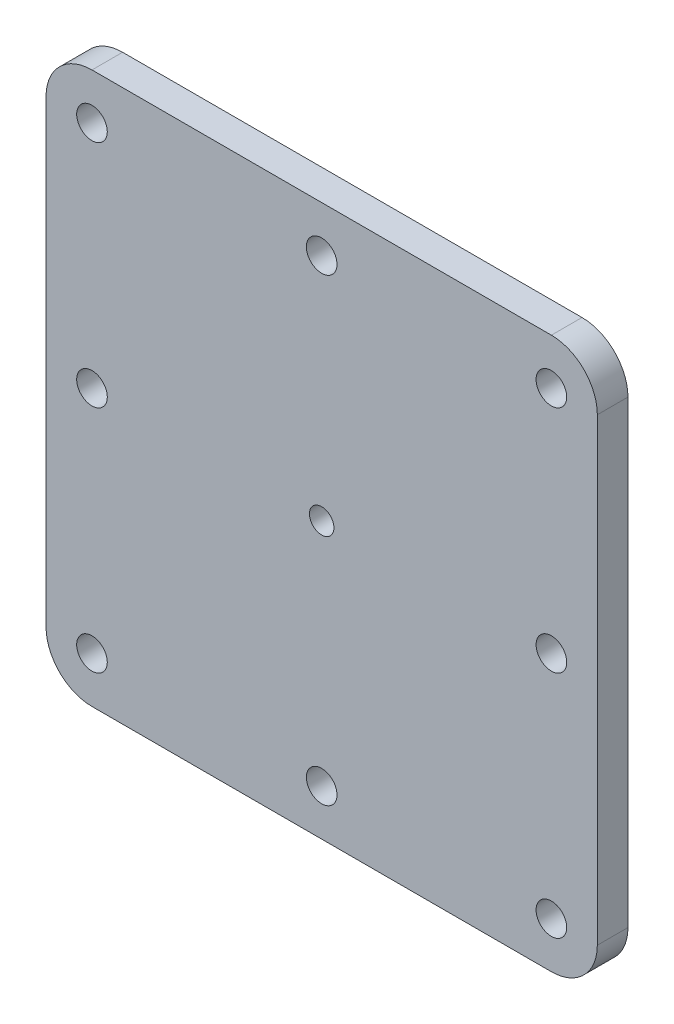
ISO-10303-21;
HEADER;
FILE_DESCRIPTION(('STEP AP214'),'2;1');
FILE_NAME('part.step','',(''),(''),'','','');
FILE_SCHEMA(('AUTOMOTIVE_DESIGN { 1 0 10303 214 1 1 1 1 }'));
ENDSEC;
DATA;
#1=APPLICATION_CONTEXT('core data for automotive mechanical design processes');
#2=APPLICATION_PROTOCOL_DEFINITION('international standard','automotive_design',2000,#1);
#3=PRODUCT_CONTEXT('',#1,'mechanical');
#4=PRODUCT('Part','Part','',(#3));
#5=PRODUCT_RELATED_PRODUCT_CATEGORY('part','',(#4));
#6=PRODUCT_DEFINITION_FORMATION('','',#4);
#7=PRODUCT_DEFINITION_CONTEXT('part definition',#1,'design');
#8=PRODUCT_DEFINITION('design','',#6,#7);
#9=PRODUCT_DEFINITION_SHAPE('','',#8);
#10=(LENGTH_UNIT() NAMED_UNIT(*) SI_UNIT(.MILLI.,.METRE.));
#11=(NAMED_UNIT(*) PLANE_ANGLE_UNIT() SI_UNIT($,.RADIAN.));
#12=(NAMED_UNIT(*) SI_UNIT($,.STERADIAN.) SOLID_ANGLE_UNIT());
#13=UNCERTAINTY_MEASURE_WITH_UNIT(LENGTH_MEASURE(1.E-05),#10,'distance_accuracy_value','');
#14=(GEOMETRIC_REPRESENTATION_CONTEXT(3) GLOBAL_UNCERTAINTY_ASSIGNED_CONTEXT((#13)) GLOBAL_UNIT_ASSIGNED_CONTEXT((#10,
#11,#12)) REPRESENTATION_CONTEXT('',''));
#15=CARTESIAN_POINT('',(0.,0.,0.));
#16=DIRECTION('',(0.,0.,1.));
#17=DIRECTION('',(1.,0.,0.));
#18=AXIS2_PLACEMENT_3D('',#15,#16,#17);
#19=CARTESIAN_POINT('',(-75.,-75.,10.));
#20=DIRECTION('',(0.,0.,1.));
#21=DIRECTION('',(1.,0.,0.));
#22=AXIS2_PLACEMENT_3D('',#19,#20,#21);
#23=PLANE('',#22);
#24=CARTESIAN_POINT('',(0.,0.,10.));
#25=DIRECTION('',(0.,0.,1.));
#26=DIRECTION('',(1.,0.,0.));
#27=AXIS2_PLACEMENT_3D('',#24,#25,#26);
#28=CIRCLE('',#27,4.);
#29=CARTESIAN_POINT('',(3.99999999999999,0.,10.));
#30=VERTEX_POINT('',#29);
#31=EDGE_CURVE('E227',#30,#30,#28,.T.);
#32=ORIENTED_EDGE('',*,*,#31,.F.);
#33=EDGE_LOOP('',(#32));
#34=FACE_BOUND('',#33,.T.);
#35=CARTESIAN_POINT('',(1.54341102686378E-12,-75.,10.));
#36=DIRECTION('',(0.,0.,1.));
#37=DIRECTION('',(1.,0.,0.));
#38=AXIS2_PLACEMENT_3D('',#35,#36,#37);
#39=CIRCLE('',#38,5.);
#40=CARTESIAN_POINT('',(5.00000000000154,-75.,10.));
#41=VERTEX_POINT('',#40);
#42=EDGE_CURVE('E212',#41,#41,#39,.T.);
#43=ORIENTED_EDGE('',*,*,#42,.F.);
#44=EDGE_LOOP('',(#43));
#45=FACE_BOUND('',#44,.T.);
#46=CARTESIAN_POINT('',(75.0000000000008,0.,10.));
#47=DIRECTION('',(0.,0.,1.));
#48=DIRECTION('',(1.,0.,0.));
#49=AXIS2_PLACEMENT_3D('',#46,#47,#48);
#50=CIRCLE('',#49,5.);
#51=CARTESIAN_POINT('',(80.0000000000008,0.,10.));
#52=VERTEX_POINT('',#51);
#53=EDGE_CURVE('E200',#52,#52,#50,.T.);
#54=ORIENTED_EDGE('',*,*,#53,.F.);
#55=EDGE_LOOP('',(#54));
#56=FACE_BOUND('',#55,.T.);
#57=CARTESIAN_POINT('',(75.,75.,10.));
#58=DIRECTION('',(0.,0.,1.));
#59=DIRECTION('',(1.,0.,0.));
#60=AXIS2_PLACEMENT_3D('',#57,#58,#59);
#61=CIRCLE('',#60,5.00000000000001);
#62=CARTESIAN_POINT('',(80.,75.,10.));
#63=VERTEX_POINT('',#62);
#64=EDGE_CURVE('E188',#63,#63,#61,.T.);
#65=ORIENTED_EDGE('',*,*,#64,.F.);
#66=EDGE_LOOP('',(#65));
#67=FACE_BOUND('',#66,.T.);
#68=CARTESIAN_POINT('',(-75.,75.,10.));
#69=DIRECTION('',(0.,0.,1.));
#70=DIRECTION('',(1.,0.,0.));
#71=AXIS2_PLACEMENT_3D('',#68,#69,#70);
#72=CIRCLE('',#71,5.00000000000001);
#73=CARTESIAN_POINT('',(-70.,75.,10.));
#74=VERTEX_POINT('',#73);
#75=EDGE_CURVE('E134',#74,#74,#72,.T.);
#76=ORIENTED_EDGE('',*,*,#75,.F.);
#77=EDGE_LOOP('',(#76));
#78=FACE_BOUND('',#77,.T.);
#79=CARTESIAN_POINT('',(-75.,-75.,10.));
#80=DIRECTION('',(0.,0.,1.));
#81=DIRECTION('',(1.,0.,0.));
#82=AXIS2_PLACEMENT_3D('',#79,#80,#81);
#83=CIRCLE('',#82,15.);
#84=CARTESIAN_POINT('',(-90.,-74.9999999999999,10.));
#85=VERTEX_POINT('',#84);
#86=CARTESIAN_POINT('',(-74.9999999999999,-90.,10.));
#87=VERTEX_POINT('',#86);
#88=EDGE_CURVE('E145',#85,#87,#83,.T.);
#89=ORIENTED_EDGE('',*,*,#88,.T.);
#90=DIRECTION('',(1.,0.,0.));
#91=VECTOR('',#90,1.);
#92=CARTESIAN_POINT('',(-74.9999999999999,-90.,10.));
#93=LINE('',#92,#91);
#94=CARTESIAN_POINT('',(75.,-89.9999999999992,10.));
#95=VERTEX_POINT('',#94);
#96=EDGE_CURVE('E93',#87,#95,#93,.T.);
#97=ORIENTED_EDGE('',*,*,#96,.T.);
#98=CARTESIAN_POINT('',(75.,-74.9999999999992,10.));
#99=DIRECTION('',(0.,0.,1.));
#100=DIRECTION('',(1.,0.,0.));
#101=AXIS2_PLACEMENT_3D('',#98,#99,#100);
#102=CIRCLE('',#101,15.);
#103=CARTESIAN_POINT('',(90.,-75.,10.));
#104=VERTEX_POINT('',#103);
#105=EDGE_CURVE('E160',#95,#104,#102,.T.);
#106=ORIENTED_EDGE('',*,*,#105,.T.);
#107=DIRECTION('',(0.,1.,0.));
#108=VECTOR('',#107,1.);
#109=CARTESIAN_POINT('',(90.,75.0000000000019,10.));
#110=LINE('',#109,#108);
#111=CARTESIAN_POINT('',(90.,75.0000000000019,10.));
#112=VERTEX_POINT('',#111);
#113=EDGE_CURVE('E173',#104,#112,#110,.T.);
#114=ORIENTED_EDGE('',*,*,#113,.T.);
#115=CARTESIAN_POINT('',(75.,75.,10.));
#116=DIRECTION('',(0.,0.,1.));
#117=DIRECTION('',(-1.,0.,0.));
#118=AXIS2_PLACEMENT_3D('',#115,#116,#117);
#119=CIRCLE('',#118,15.);
#120=CARTESIAN_POINT('',(74.9999999999999,90.,10.));
#121=VERTEX_POINT('',#120);
#122=EDGE_CURVE('E112',#112,#121,#119,.T.);
#123=ORIENTED_EDGE('',*,*,#122,.T.);
#124=DIRECTION('',(-1.,0.,0.));
#125=VECTOR('',#124,1.);
#126=CARTESIAN_POINT('',(-74.9999999999999,90.,10.));
#127=LINE('',#126,#125);
#128=CARTESIAN_POINT('',(-74.9999999999999,90.,10.));
#129=VERTEX_POINT('',#128);
#130=EDGE_CURVE('E106',#121,#129,#127,.T.);
#131=ORIENTED_EDGE('',*,*,#130,.T.);
#132=CARTESIAN_POINT('',(-75.,75.,10.));
#133=DIRECTION('',(0.,0.,1.));
#134=DIRECTION('',(1.,0.,0.));
#135=AXIS2_PLACEMENT_3D('',#132,#133,#134);
#136=CIRCLE('',#135,15.);
#137=CARTESIAN_POINT('',(-90.,74.9999999999999,10.));
#138=VERTEX_POINT('',#137);
#139=EDGE_CURVE('E110',#129,#138,#136,.T.);
#140=ORIENTED_EDGE('',*,*,#139,.T.);
#141=DIRECTION('',(0.,-1.,0.));
#142=VECTOR('',#141,1.);
#143=CARTESIAN_POINT('',(-90.,74.9999999999999,10.));
#144=LINE('',#143,#142);
#145=EDGE_CURVE('E50',#138,#85,#144,.T.);
#146=ORIENTED_EDGE('',*,*,#145,.T.);
#147=EDGE_LOOP('',(#89,#97,#106,#114,#123,#131,#140,#146));
#148=FACE_BOUND('',#147,.T.);
#149=CARTESIAN_POINT('',(0.,75.,10.));
#150=DIRECTION('',(0.,0.,1.));
#151=DIRECTION('',(1.,0.,0.));
#152=AXIS2_PLACEMENT_3D('',#149,#150,#151);
#153=CIRCLE('',#152,5.);
#154=CARTESIAN_POINT('',(4.99999999999997,75.,10.));
#155=VERTEX_POINT('',#154);
#156=EDGE_CURVE('E182',#155,#155,#153,.T.);
#157=ORIENTED_EDGE('',*,*,#156,.F.);
#158=EDGE_LOOP('',(#157));
#159=FACE_BOUND('',#158,.T.);
#160=CARTESIAN_POINT('',(-74.9999999999992,0.,10.));
#161=DIRECTION('',(0.,0.,1.));
#162=DIRECTION('',(1.,0.,0.));
#163=AXIS2_PLACEMENT_3D('',#160,#161,#162);
#164=CIRCLE('',#163,5.);
#165=CARTESIAN_POINT('',(-69.9999999999992,0.,10.));
#166=VERTEX_POINT('',#165);
#167=EDGE_CURVE('E194',#166,#166,#164,.T.);
#168=ORIENTED_EDGE('',*,*,#167,.F.);
#169=EDGE_LOOP('',(#168));
#170=FACE_BOUND('',#169,.T.);
#171=CARTESIAN_POINT('',(-74.9999999999985,-75.,10.));
#172=DIRECTION('',(0.,0.,1.));
#173=DIRECTION('',(1.,0.,0.));
#174=AXIS2_PLACEMENT_3D('',#171,#172,#173);
#175=CIRCLE('',#174,5.00000000000001);
#176=CARTESIAN_POINT('',(-69.9999999999985,-75.,10.));
#177=VERTEX_POINT('',#176);
#178=EDGE_CURVE('E206',#177,#177,#175,.T.);
#179=ORIENTED_EDGE('',*,*,#178,.F.);
#180=EDGE_LOOP('',(#179));
#181=FACE_BOUND('',#180,.T.);
#182=CARTESIAN_POINT('',(75.0000000000015,-75.,10.));
#183=DIRECTION('',(0.,0.,1.));
#184=DIRECTION('',(1.,0.,0.));
#185=AXIS2_PLACEMENT_3D('',#182,#183,#184);
#186=CIRCLE('',#185,5.00000000000001);
#187=CARTESIAN_POINT('',(80.0000000000015,-75.,10.));
#188=VERTEX_POINT('',#187);
#189=EDGE_CURVE('E218',#188,#188,#186,.T.);
#190=ORIENTED_EDGE('',*,*,#189,.F.);
#191=EDGE_LOOP('',(#190));
#192=FACE_BOUND('',#191,.T.);
#193=ADVANCED_FACE('F33',(#34,#45,#56,#67,#78,#148,#159,#170,#181,#192),#23,.T.);
#194=CARTESIAN_POINT('',(-75.,-75.,0.));
#195=DIRECTION('',(0.,0.,1.));
#196=DIRECTION('',(1.,0.,0.));
#197=AXIS2_PLACEMENT_3D('',#194,#195,#196);
#198=PLANE('',#197);
#199=CARTESIAN_POINT('',(0.,0.,0.));
#200=DIRECTION('',(0.,0.,1.));
#201=DIRECTION('',(1.,0.,0.));
#202=AXIS2_PLACEMENT_3D('',#199,#200,#201);
#203=CIRCLE('',#202,4.);
#204=CARTESIAN_POINT('',(3.99999999999999,0.,0.));
#205=VERTEX_POINT('',#204);
#206=EDGE_CURVE('E224',#205,#205,#203,.T.);
#207=ORIENTED_EDGE('',*,*,#206,.T.);
#208=EDGE_LOOP('',(#207));
#209=FACE_BOUND('',#208,.T.);
#210=CARTESIAN_POINT('',(-75.,-75.,0.));
#211=DIRECTION('',(0.,0.,1.));
#212=DIRECTION('',(1.,0.,0.));
#213=AXIS2_PLACEMENT_3D('',#210,#211,#212);
#214=CIRCLE('',#213,15.);
#215=CARTESIAN_POINT('',(-90.,-74.9999999999999,0.));
#216=VERTEX_POINT('',#215);
#217=CARTESIAN_POINT('',(-74.9999999999999,-90.,0.));
#218=VERTEX_POINT('',#217);
#219=EDGE_CURVE('E130',#216,#218,#214,.T.);
#220=ORIENTED_EDGE('',*,*,#219,.F.);
#221=DIRECTION('',(0.,-1.,0.));
#222=VECTOR('',#221,1.);
#223=CARTESIAN_POINT('',(-90.,74.9999999999999,0.));
#224=LINE('',#223,#222);
#225=CARTESIAN_POINT('',(-90.,74.9999999999999,0.));
#226=VERTEX_POINT('',#225);
#227=EDGE_CURVE('E85',#226,#216,#224,.T.);
#228=ORIENTED_EDGE('',*,*,#227,.F.);
#229=CARTESIAN_POINT('',(-75.,75.,0.));
#230=DIRECTION('',(0.,0.,1.));
#231=DIRECTION('',(1.,0.,0.));
#232=AXIS2_PLACEMENT_3D('',#229,#230,#231);
#233=CIRCLE('',#232,15.);
#234=CARTESIAN_POINT('',(-74.9999999999999,90.,0.));
#235=VERTEX_POINT('',#234);
#236=EDGE_CURVE('E79',#235,#226,#233,.T.);
#237=ORIENTED_EDGE('',*,*,#236,.F.);
#238=DIRECTION('',(-1.,0.,0.));
#239=VECTOR('',#238,1.);
#240=CARTESIAN_POINT('',(-74.9999999999999,90.,0.));
#241=LINE('',#240,#239);
#242=CARTESIAN_POINT('',(74.9999999999999,90.,0.));
#243=VERTEX_POINT('',#242);
#244=EDGE_CURVE('E120',#243,#235,#241,.T.);
#245=ORIENTED_EDGE('',*,*,#244,.F.);
#246=CARTESIAN_POINT('',(75.,75.,0.));
#247=DIRECTION('',(0.,0.,1.));
#248=DIRECTION('',(-1.,0.,0.));
#249=AXIS2_PLACEMENT_3D('',#246,#247,#248);
#250=CIRCLE('',#249,15.);
#251=CARTESIAN_POINT('',(90.,75.0000000000019,0.));
#252=VERTEX_POINT('',#251);
#253=EDGE_CURVE('E140',#252,#243,#250,.T.);
#254=ORIENTED_EDGE('',*,*,#253,.F.);
#255=DIRECTION('',(0.,1.,0.));
#256=VECTOR('',#255,1.);
#257=CARTESIAN_POINT('',(90.,75.0000000000019,0.));
#258=LINE('',#257,#256);
#259=CARTESIAN_POINT('',(90.,-75.,0.));
#260=VERTEX_POINT('',#259);
#261=EDGE_CURVE('E138',#260,#252,#258,.T.);
#262=ORIENTED_EDGE('',*,*,#261,.F.);
#263=CARTESIAN_POINT('',(75.,-74.9999999999992,0.));
#264=DIRECTION('',(0.,0.,1.));
#265=DIRECTION('',(1.,0.,0.));
#266=AXIS2_PLACEMENT_3D('',#263,#264,#265);
#267=CIRCLE('',#266,15.);
#268=CARTESIAN_POINT('',(75.,-89.9999999999992,0.));
#269=VERTEX_POINT('',#268);
#270=EDGE_CURVE('E136',#269,#260,#267,.T.);
#271=ORIENTED_EDGE('',*,*,#270,.F.);
#272=DIRECTION('',(1.,0.,0.));
#273=VECTOR('',#272,1.);
#274=CARTESIAN_POINT('',(-74.9999999999999,-90.,0.));
#275=LINE('',#274,#273);
#276=EDGE_CURVE('E133',#218,#269,#275,.T.);
#277=ORIENTED_EDGE('',*,*,#276,.F.);
#278=EDGE_LOOP('',(#220,#228,#237,#245,#254,#262,#271,#277));
#279=FACE_BOUND('',#278,.T.);
#280=CARTESIAN_POINT('',(-75.,75.,0.));
#281=DIRECTION('',(0.,0.,1.));
#282=DIRECTION('',(1.,0.,0.));
#283=AXIS2_PLACEMENT_3D('',#280,#281,#282);
#284=CIRCLE('',#283,5.00000000000001);
#285=CARTESIAN_POINT('',(-70.,75.,0.));
#286=VERTEX_POINT('',#285);
#287=EDGE_CURVE('E179',#286,#286,#284,.T.);
#288=ORIENTED_EDGE('',*,*,#287,.T.);
#289=EDGE_LOOP('',(#288));
#290=FACE_BOUND('',#289,.T.);
#291=CARTESIAN_POINT('',(0.,75.,0.));
#292=DIRECTION('',(0.,0.,1.));
#293=DIRECTION('',(1.,0.,0.));
#294=AXIS2_PLACEMENT_3D('',#291,#292,#293);
#295=CIRCLE('',#294,5.);
#296=CARTESIAN_POINT('',(4.99999999999997,75.,0.));
#297=VERTEX_POINT('',#296);
#298=EDGE_CURVE('E185',#297,#297,#295,.T.);
#299=ORIENTED_EDGE('',*,*,#298,.T.);
#300=EDGE_LOOP('',(#299));
#301=FACE_BOUND('',#300,.T.);
#302=CARTESIAN_POINT('',(75.,75.,0.));
#303=DIRECTION('',(0.,0.,1.));
#304=DIRECTION('',(1.,0.,0.));
#305=AXIS2_PLACEMENT_3D('',#302,#303,#304);
#306=CIRCLE('',#305,5.00000000000001);
#307=CARTESIAN_POINT('',(80.,75.,0.));
#308=VERTEX_POINT('',#307);
#309=EDGE_CURVE('E191',#308,#308,#306,.T.);
#310=ORIENTED_EDGE('',*,*,#309,.T.);
#311=EDGE_LOOP('',(#310));
#312=FACE_BOUND('',#311,.T.);
#313=CARTESIAN_POINT('',(-74.9999999999992,0.,0.));
#314=DIRECTION('',(0.,0.,1.));
#315=DIRECTION('',(1.,0.,0.));
#316=AXIS2_PLACEMENT_3D('',#313,#314,#315);
#317=CIRCLE('',#316,5.);
#318=CARTESIAN_POINT('',(-69.9999999999992,0.,0.));
#319=VERTEX_POINT('',#318);
#320=EDGE_CURVE('E197',#319,#319,#317,.T.);
#321=ORIENTED_EDGE('',*,*,#320,.T.);
#322=EDGE_LOOP('',(#321));
#323=FACE_BOUND('',#322,.T.);
#324=CARTESIAN_POINT('',(75.0000000000008,0.,0.));
#325=DIRECTION('',(0.,0.,1.));
#326=DIRECTION('',(1.,0.,0.));
#327=AXIS2_PLACEMENT_3D('',#324,#325,#326);
#328=CIRCLE('',#327,5.);
#329=CARTESIAN_POINT('',(80.0000000000008,0.,0.));
#330=VERTEX_POINT('',#329);
#331=EDGE_CURVE('E203',#330,#330,#328,.T.);
#332=ORIENTED_EDGE('',*,*,#331,.T.);
#333=EDGE_LOOP('',(#332));
#334=FACE_BOUND('',#333,.T.);
#335=CARTESIAN_POINT('',(-74.9999999999985,-75.,0.));
#336=DIRECTION('',(0.,0.,1.));
#337=DIRECTION('',(1.,0.,0.));
#338=AXIS2_PLACEMENT_3D('',#335,#336,#337);
#339=CIRCLE('',#338,5.00000000000001);
#340=CARTESIAN_POINT('',(-69.9999999999985,-75.,0.));
#341=VERTEX_POINT('',#340);
#342=EDGE_CURVE('E209',#341,#341,#339,.T.);
#343=ORIENTED_EDGE('',*,*,#342,.T.);
#344=EDGE_LOOP('',(#343));
#345=FACE_BOUND('',#344,.T.);
#346=CARTESIAN_POINT('',(1.54341102686378E-12,-75.,0.));
#347=DIRECTION('',(0.,0.,1.));
#348=DIRECTION('',(1.,0.,0.));
#349=AXIS2_PLACEMENT_3D('',#346,#347,#348);
#350=CIRCLE('',#349,5.);
#351=CARTESIAN_POINT('',(5.00000000000154,-75.,0.));
#352=VERTEX_POINT('',#351);
#353=EDGE_CURVE('E215',#352,#352,#350,.T.);
#354=ORIENTED_EDGE('',*,*,#353,.T.);
#355=EDGE_LOOP('',(#354));
#356=FACE_BOUND('',#355,.T.);
#357=CARTESIAN_POINT('',(75.0000000000015,-75.,0.));
#358=DIRECTION('',(0.,0.,1.));
#359=DIRECTION('',(1.,0.,0.));
#360=AXIS2_PLACEMENT_3D('',#357,#358,#359);
#361=CIRCLE('',#360,5.00000000000001);
#362=CARTESIAN_POINT('',(80.0000000000015,-75.,0.));
#363=VERTEX_POINT('',#362);
#364=EDGE_CURVE('E221',#363,#363,#361,.T.);
#365=ORIENTED_EDGE('',*,*,#364,.T.);
#366=EDGE_LOOP('',(#365));
#367=FACE_BOUND('',#366,.T.);
#368=ADVANCED_FACE('F164',(#209,#279,#290,#301,#312,#323,#334,#345,#356,#367),#198,.F.);
#369=CARTESIAN_POINT('',(-75.,-75.,10.));
#370=DIRECTION('',(0.,0.,-1.));
#371=DIRECTION('',(-1.,0.,0.));
#372=AXIS2_PLACEMENT_3D('',#369,#370,#371);
#373=CYLINDRICAL_SURFACE('',#372,15.);
#374=ORIENTED_EDGE('',*,*,#219,.T.);
#375=DIRECTION('',(0.,0.,-1.));
#376=VECTOR('',#375,1.);
#377=CARTESIAN_POINT('',(-74.9999999999999,-90.,10.));
#378=LINE('',#377,#376);
#379=EDGE_CURVE('E11',#87,#218,#378,.T.);
#380=ORIENTED_EDGE('',*,*,#379,.F.);
#381=ORIENTED_EDGE('',*,*,#88,.F.);
#382=DIRECTION('',(0.,0.,-1.));
#383=VECTOR('',#382,1.);
#384=CARTESIAN_POINT('',(-90.,-74.9999999999999,10.));
#385=LINE('',#384,#383);
#386=EDGE_CURVE('E126',#85,#216,#385,.T.);
#387=ORIENTED_EDGE('',*,*,#386,.T.);
#388=EDGE_LOOP('',(#374,#380,#381,#387));
#389=FACE_BOUND('',#388,.T.);
#390=ADVANCED_FACE('F35',(#389),#373,.T.);
#391=CARTESIAN_POINT('',(-74.9999999999999,-90.,10.));
#392=DIRECTION('',(0.,1.,0.));
#393=DIRECTION('',(-1.,0.,0.));
#394=AXIS2_PLACEMENT_3D('',#391,#392,#393);
#395=PLANE('',#394);
#396=ORIENTED_EDGE('',*,*,#276,.T.);
#397=DIRECTION('',(0.,0.,-1.));
#398=VECTOR('',#397,1.);
#399=CARTESIAN_POINT('',(75.,-89.9999999999992,10.));
#400=LINE('',#399,#398);
#401=EDGE_CURVE('E42',#95,#269,#400,.T.);
#402=ORIENTED_EDGE('',*,*,#401,.F.);
#403=ORIENTED_EDGE('',*,*,#96,.F.);
#404=ORIENTED_EDGE('',*,*,#379,.T.);
#405=EDGE_LOOP('',(#396,#402,#403,#404));
#406=FACE_BOUND('',#405,.T.);
#407=ADVANCED_FACE('F316',(#406),#395,.F.);
#408=CARTESIAN_POINT('',(75.,-74.9999999999992,10.));
#409=DIRECTION('',(0.,0.,-1.));
#410=DIRECTION('',(-1.,0.,0.));
#411=AXIS2_PLACEMENT_3D('',#408,#409,#410);
#412=CYLINDRICAL_SURFACE('',#411,15.);
#413=ORIENTED_EDGE('',*,*,#270,.T.);
#414=DIRECTION('',(0.,0.,-1.));
#415=VECTOR('',#414,1.);
#416=CARTESIAN_POINT('',(90.,-75.,10.));
#417=LINE('',#416,#415);
#418=EDGE_CURVE('E152',#104,#260,#417,.T.);
#419=ORIENTED_EDGE('',*,*,#418,.F.);
#420=ORIENTED_EDGE('',*,*,#105,.F.);
#421=ORIENTED_EDGE('',*,*,#401,.T.);
#422=EDGE_LOOP('',(#413,#419,#420,#421));
#423=FACE_BOUND('',#422,.T.);
#424=ADVANCED_FACE('F158',(#423),#412,.T.);
#425=CARTESIAN_POINT('',(90.,75.0000000000019,10.));
#426=DIRECTION('',(-1.,0.,0.));
#427=DIRECTION('',(0.,-1.,0.));
#428=AXIS2_PLACEMENT_3D('',#425,#426,#427);
#429=PLANE('',#428);
#430=ORIENTED_EDGE('',*,*,#261,.T.);
#431=DIRECTION('',(0.,0.,-1.));
#432=VECTOR('',#431,1.);
#433=CARTESIAN_POINT('',(90.,75.0000000000019,10.));
#434=LINE('',#433,#432);
#435=EDGE_CURVE('E149',#112,#252,#434,.T.);
#436=ORIENTED_EDGE('',*,*,#435,.F.);
#437=ORIENTED_EDGE('',*,*,#113,.F.);
#438=ORIENTED_EDGE('',*,*,#418,.T.);
#439=EDGE_LOOP('',(#430,#436,#437,#438));
#440=FACE_BOUND('',#439,.T.);
#441=ADVANCED_FACE('F169',(#440),#429,.F.);
#442=CARTESIAN_POINT('',(75.,75.,10.));
#443=DIRECTION('',(0.,0.,-1.));
#444=DIRECTION('',(-1.,0.,0.));
#445=AXIS2_PLACEMENT_3D('',#442,#443,#444);
#446=CYLINDRICAL_SURFACE('',#445,15.);
#447=ORIENTED_EDGE('',*,*,#253,.T.);
#448=DIRECTION('',(0.,0.,-1.));
#449=VECTOR('',#448,1.);
#450=CARTESIAN_POINT('',(74.9999999999999,90.,10.));
#451=LINE('',#450,#449);
#452=EDGE_CURVE('E121',#121,#243,#451,.T.);
#453=ORIENTED_EDGE('',*,*,#452,.F.);
#454=ORIENTED_EDGE('',*,*,#122,.F.);
#455=ORIENTED_EDGE('',*,*,#435,.T.);
#456=EDGE_LOOP('',(#447,#453,#454,#455));
#457=FACE_BOUND('',#456,.T.);
#458=ADVANCED_FACE('F172',(#457),#446,.T.);
#459=CARTESIAN_POINT('',(-74.9999999999999,90.,10.));
#460=DIRECTION('',(0.,-1.,0.));
#461=DIRECTION('',(0.,0.,-1.));
#462=AXIS2_PLACEMENT_3D('',#459,#460,#461);
#463=PLANE('',#462);
#464=ORIENTED_EDGE('',*,*,#244,.T.);
#465=DIRECTION('',(0.,0.,-1.));
#466=VECTOR('',#465,1.);
#467=CARTESIAN_POINT('',(-74.9999999999999,90.,10.));
#468=LINE('',#467,#466);
#469=EDGE_CURVE('E117',#129,#235,#468,.T.);
#470=ORIENTED_EDGE('',*,*,#469,.F.);
#471=ORIENTED_EDGE('',*,*,#130,.F.);
#472=ORIENTED_EDGE('',*,*,#452,.T.);
#473=EDGE_LOOP('',(#464,#470,#471,#472));
#474=FACE_BOUND('',#473,.T.);
#475=ADVANCED_FACE('F118',(#474),#463,.F.);
#476=CARTESIAN_POINT('',(-75.,75.,10.));
#477=DIRECTION('',(0.,0.,-1.));
#478=DIRECTION('',(-1.,0.,0.));
#479=AXIS2_PLACEMENT_3D('',#476,#477,#478);
#480=CYLINDRICAL_SURFACE('',#479,15.);
#481=ORIENTED_EDGE('',*,*,#236,.T.);
#482=DIRECTION('',(0.,0.,-1.));
#483=VECTOR('',#482,1.);
#484=CARTESIAN_POINT('',(-90.,74.9999999999999,10.));
#485=LINE('',#484,#483);
#486=EDGE_CURVE('E122',#138,#226,#485,.T.);
#487=ORIENTED_EDGE('',*,*,#486,.F.);
#488=ORIENTED_EDGE('',*,*,#139,.F.);
#489=ORIENTED_EDGE('',*,*,#469,.T.);
#490=EDGE_LOOP('',(#481,#487,#488,#489));
#491=FACE_BOUND('',#490,.T.);
#492=ADVANCED_FACE('F124',(#491),#480,.T.);
#493=CARTESIAN_POINT('',(-90.,74.9999999999999,10.));
#494=DIRECTION('',(1.,0.,0.));
#495=DIRECTION('',(0.,1.,0.));
#496=AXIS2_PLACEMENT_3D('',#493,#494,#495);
#497=PLANE('',#496);
#498=ORIENTED_EDGE('',*,*,#227,.T.);
#499=ORIENTED_EDGE('',*,*,#386,.F.);
#500=ORIENTED_EDGE('',*,*,#145,.F.);
#501=ORIENTED_EDGE('',*,*,#486,.T.);
#502=EDGE_LOOP('',(#498,#499,#500,#501));
#503=FACE_BOUND('',#502,.T.);
#504=ADVANCED_FACE('F256',(#503),#497,.F.);
#505=CARTESIAN_POINT('',(-75.,75.,10.));
#506=DIRECTION('',(0.,0.,-1.));
#507=DIRECTION('',(-1.,0.,0.));
#508=AXIS2_PLACEMENT_3D('',#505,#506,#507);
#509=CYLINDRICAL_SURFACE('',#508,5.00000000000001);
#510=ORIENTED_EDGE('',*,*,#75,.T.);
#511=EDGE_LOOP('',(#510));
#512=FACE_BOUND('',#511,.T.);
#513=ORIENTED_EDGE('',*,*,#287,.F.);
#514=EDGE_LOOP('',(#513));
#515=FACE_BOUND('',#514,.T.);
#516=ADVANCED_FACE('F252',(#512,#515),#509,.F.);
#517=CARTESIAN_POINT('',(0.,75.,10.));
#518=DIRECTION('',(0.,0.,-1.));
#519=DIRECTION('',(-1.,0.,0.));
#520=AXIS2_PLACEMENT_3D('',#517,#518,#519);
#521=CYLINDRICAL_SURFACE('',#520,5.);
#522=ORIENTED_EDGE('',*,*,#156,.T.);
#523=EDGE_LOOP('',(#522));
#524=FACE_BOUND('',#523,.T.);
#525=ORIENTED_EDGE('',*,*,#298,.F.);
#526=EDGE_LOOP('',(#525));
#527=FACE_BOUND('',#526,.T.);
#528=ADVANCED_FACE('F255',(#524,#527),#521,.F.);
#529=CARTESIAN_POINT('',(75.,75.,10.));
#530=DIRECTION('',(0.,0.,-1.));
#531=DIRECTION('',(-1.,0.,0.));
#532=AXIS2_PLACEMENT_3D('',#529,#530,#531);
#533=CYLINDRICAL_SURFACE('',#532,5.00000000000001);
#534=ORIENTED_EDGE('',*,*,#64,.T.);
#535=EDGE_LOOP('',(#534));
#536=FACE_BOUND('',#535,.T.);
#537=ORIENTED_EDGE('',*,*,#309,.F.);
#538=EDGE_LOOP('',(#537));
#539=FACE_BOUND('',#538,.T.);
#540=ADVANCED_FACE('F297',(#536,#539),#533,.F.);
#541=CARTESIAN_POINT('',(-74.9999999999992,0.,10.));
#542=DIRECTION('',(0.,0.,-1.));
#543=DIRECTION('',(-1.,0.,0.));
#544=AXIS2_PLACEMENT_3D('',#541,#542,#543);
#545=CYLINDRICAL_SURFACE('',#544,5.);
#546=ORIENTED_EDGE('',*,*,#167,.T.);
#547=EDGE_LOOP('',(#546));
#548=FACE_BOUND('',#547,.T.);
#549=ORIENTED_EDGE('',*,*,#320,.F.);
#550=EDGE_LOOP('',(#549));
#551=FACE_BOUND('',#550,.T.);
#552=ADVANCED_FACE('F293',(#548,#551),#545,.F.);
#553=CARTESIAN_POINT('',(75.0000000000008,0.,10.));
#554=DIRECTION('',(0.,0.,-1.));
#555=DIRECTION('',(-1.,0.,0.));
#556=AXIS2_PLACEMENT_3D('',#553,#554,#555);
#557=CYLINDRICAL_SURFACE('',#556,5.);
#558=ORIENTED_EDGE('',*,*,#53,.T.);
#559=EDGE_LOOP('',(#558));
#560=FACE_BOUND('',#559,.T.);
#561=ORIENTED_EDGE('',*,*,#331,.F.);
#562=EDGE_LOOP('',(#561));
#563=FACE_BOUND('',#562,.T.);
#564=ADVANCED_FACE('F289',(#560,#563),#557,.F.);
#565=CARTESIAN_POINT('',(-74.9999999999985,-75.,10.));
#566=DIRECTION('',(0.,0.,-1.));
#567=DIRECTION('',(-1.,0.,0.));
#568=AXIS2_PLACEMENT_3D('',#565,#566,#567);
#569=CYLINDRICAL_SURFACE('',#568,5.00000000000001);
#570=ORIENTED_EDGE('',*,*,#178,.T.);
#571=EDGE_LOOP('',(#570));
#572=FACE_BOUND('',#571,.T.);
#573=ORIENTED_EDGE('',*,*,#342,.F.);
#574=EDGE_LOOP('',(#573));
#575=FACE_BOUND('',#574,.T.);
#576=ADVANCED_FACE('F283',(#572,#575),#569,.F.);
#577=CARTESIAN_POINT('',(1.54341102686378E-12,-75.,10.));
#578=DIRECTION('',(0.,0.,-1.));
#579=DIRECTION('',(-1.,0.,0.));
#580=AXIS2_PLACEMENT_3D('',#577,#578,#579);
#581=CYLINDRICAL_SURFACE('',#580,5.);
#582=ORIENTED_EDGE('',*,*,#42,.T.);
#583=EDGE_LOOP('',(#582));
#584=FACE_BOUND('',#583,.T.);
#585=ORIENTED_EDGE('',*,*,#353,.F.);
#586=EDGE_LOOP('',(#585));
#587=FACE_BOUND('',#586,.T.);
#588=ADVANCED_FACE('F277',(#584,#587),#581,.F.);
#589=CARTESIAN_POINT('',(75.0000000000015,-75.,10.));
#590=DIRECTION('',(0.,0.,-1.));
#591=DIRECTION('',(-1.,0.,0.));
#592=AXIS2_PLACEMENT_3D('',#589,#590,#591);
#593=CYLINDRICAL_SURFACE('',#592,5.00000000000001);
#594=ORIENTED_EDGE('',*,*,#189,.T.);
#595=EDGE_LOOP('',(#594));
#596=FACE_BOUND('',#595,.T.);
#597=ORIENTED_EDGE('',*,*,#364,.F.);
#598=EDGE_LOOP('',(#597));
#599=FACE_BOUND('',#598,.T.);
#600=ADVANCED_FACE('F237',(#596,#599),#593,.F.);
#601=CARTESIAN_POINT('',(0.,0.,0.));
#602=DIRECTION('',(0.,0.,1.));
#603=DIRECTION('',(1.,0.,0.));
#604=AXIS2_PLACEMENT_3D('',#601,#602,#603);
#605=CYLINDRICAL_SURFACE('',#604,4.);
#606=ORIENTED_EDGE('',*,*,#206,.F.);
#607=EDGE_LOOP('',(#606));
#608=FACE_BOUND('',#607,.T.);
#609=ORIENTED_EDGE('',*,*,#31,.T.);
#610=EDGE_LOOP('',(#609));
#611=FACE_BOUND('',#610,.T.);
#612=ADVANCED_FACE('F234',(#608,#611),#605,.F.);
#613=CLOSED_SHELL('',(#193,#368,#390,#407,#424,#441,#458,#475,#492,#504,#516,#528,#540,#552,
#564,#576,#588,#600,#612));
#614=MANIFOLD_SOLID_BREP('B2',#613);
#615=ADVANCED_BREP_SHAPE_REPRESENTATION('',(#18,#614),#14);
#616=SHAPE_DEFINITION_REPRESENTATION(#9,#615);
ENDSEC;
END-ISO-10303-21;
